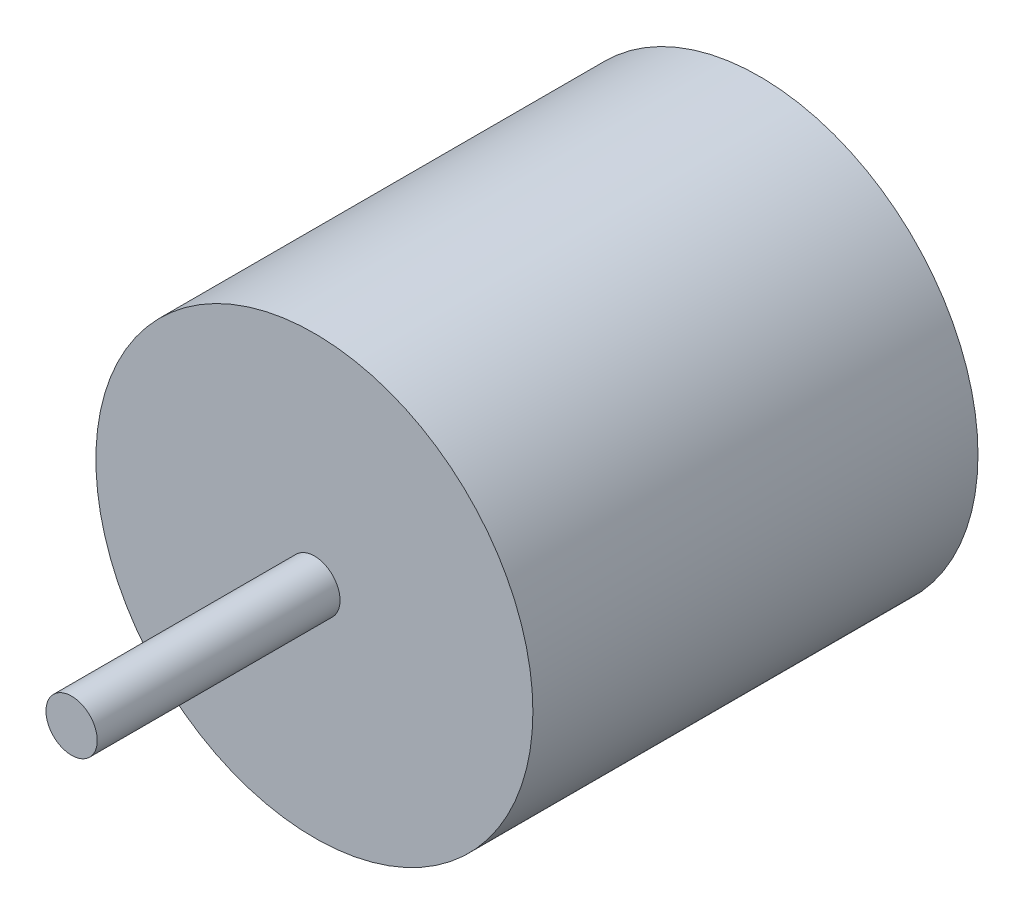
ISO-10303-21;
HEADER;
FILE_DESCRIPTION(('STEP AP214'),'2;1');
FILE_NAME('part.step','',(''),(''),'','','');
FILE_SCHEMA(('AUTOMOTIVE_DESIGN { 1 0 10303 214 1 1 1 1 }'));
ENDSEC;
DATA;
#1=APPLICATION_CONTEXT('core data for automotive mechanical design processes');
#2=APPLICATION_PROTOCOL_DEFINITION('international standard','automotive_design',2000,#1);
#3=PRODUCT_CONTEXT('',#1,'mechanical');
#4=PRODUCT('Part','Part','',(#3));
#5=PRODUCT_RELATED_PRODUCT_CATEGORY('part','',(#4));
#6=PRODUCT_DEFINITION_FORMATION('','',#4);
#7=PRODUCT_DEFINITION_CONTEXT('part definition',#1,'design');
#8=PRODUCT_DEFINITION('design','',#6,#7);
#9=PRODUCT_DEFINITION_SHAPE('','',#8);
#10=(LENGTH_UNIT() NAMED_UNIT(*) SI_UNIT(.MILLI.,.METRE.));
#11=(NAMED_UNIT(*) PLANE_ANGLE_UNIT() SI_UNIT($,.RADIAN.));
#12=(NAMED_UNIT(*) SI_UNIT($,.STERADIAN.) SOLID_ANGLE_UNIT());
#13=UNCERTAINTY_MEASURE_WITH_UNIT(LENGTH_MEASURE(1.E-05),#10,'distance_accuracy_value','');
#14=(GEOMETRIC_REPRESENTATION_CONTEXT(3) GLOBAL_UNCERTAINTY_ASSIGNED_CONTEXT((#13)) GLOBAL_UNIT_ASSIGNED_CONTEXT((#10,
#11,#12)) REPRESENTATION_CONTEXT('',''));
#15=CARTESIAN_POINT('',(0.,0.,0.));
#16=DIRECTION('',(0.,0.,1.));
#17=DIRECTION('',(1.,0.,0.));
#18=AXIS2_PLACEMENT_3D('',#15,#16,#17);
#19=CARTESIAN_POINT('',(0.,0.,27.5));
#20=DIRECTION('',(0.,0.,-1.));
#21=DIRECTION('',(-1.,0.,0.));
#22=AXIS2_PLACEMENT_3D('',#19,#20,#21);
#23=CYLINDRICAL_SURFACE('',#22,13.5);
#24=CARTESIAN_POINT('',(0.,0.,27.5));
#25=DIRECTION('',(0.,0.,1.));
#26=DIRECTION('',(1.,0.,0.));
#27=AXIS2_PLACEMENT_3D('',#24,#25,#26);
#28=CIRCLE('',#27,13.5);
#29=CARTESIAN_POINT('',(13.5,0.,27.5));
#30=VERTEX_POINT('',#29);
#31=EDGE_CURVE('E10',#30,#30,#28,.T.);
#32=ORIENTED_EDGE('',*,*,#31,.F.);
#33=EDGE_LOOP('',(#32));
#34=FACE_BOUND('',#33,.T.);
#35=CARTESIAN_POINT('',(0.,0.,0.));
#36=DIRECTION('',(0.,0.,1.));
#37=DIRECTION('',(1.,0.,0.));
#38=AXIS2_PLACEMENT_3D('',#35,#36,#37);
#39=CIRCLE('',#38,13.5);
#40=CARTESIAN_POINT('',(13.5,0.,0.));
#41=VERTEX_POINT('',#40);
#42=EDGE_CURVE('E46',#41,#41,#39,.T.);
#43=ORIENTED_EDGE('',*,*,#42,.T.);
#44=EDGE_LOOP('',(#43));
#45=FACE_BOUND('',#44,.T.);
#46=ADVANCED_FACE('F43',(#34,#45),#23,.T.);
#47=CARTESIAN_POINT('',(0.,0.,27.5));
#48=DIRECTION('',(0.,0.,1.));
#49=DIRECTION('',(1.,0.,0.));
#50=AXIS2_PLACEMENT_3D('',#47,#48,#49);
#51=PLANE('',#50);
#52=CARTESIAN_POINT('',(0.,0.,27.5));
#53=DIRECTION('',(0.,0.,1.));
#54=DIRECTION('',(1.,0.,0.));
#55=AXIS2_PLACEMENT_3D('',#52,#53,#54);
#56=CIRCLE('',#55,1.585);
#57=CARTESIAN_POINT('',(1.585,0.,27.5));
#58=VERTEX_POINT('',#57);
#59=EDGE_CURVE('E57',#58,#58,#56,.T.);
#60=ORIENTED_EDGE('',*,*,#59,.F.);
#61=EDGE_LOOP('',(#60));
#62=FACE_BOUND('',#61,.T.);
#63=ORIENTED_EDGE('',*,*,#31,.T.);
#64=EDGE_LOOP('',(#63));
#65=FACE_BOUND('',#64,.T.);
#66=ADVANCED_FACE('F74',(#62,#65),#51,.T.);
#67=CARTESIAN_POINT('',(0.,0.,0.));
#68=DIRECTION('',(0.,0.,1.));
#69=DIRECTION('',(1.,0.,0.));
#70=AXIS2_PLACEMENT_3D('',#67,#68,#69);
#71=PLANE('',#70);
#72=ORIENTED_EDGE('',*,*,#42,.F.);
#73=EDGE_LOOP('',(#72));
#74=FACE_BOUND('',#73,.T.);
#75=ADVANCED_FACE('F70',(#74),#71,.F.);
#76=CARTESIAN_POINT('',(0.,0.,42.5));
#77=DIRECTION('',(0.,0.,-1.));
#78=DIRECTION('',(-1.,0.,0.));
#79=AXIS2_PLACEMENT_3D('',#76,#77,#78);
#80=CYLINDRICAL_SURFACE('',#79,1.585);
#81=CARTESIAN_POINT('',(0.,0.,42.5));
#82=DIRECTION('',(0.,0.,1.));
#83=DIRECTION('',(1.,0.,0.));
#84=AXIS2_PLACEMENT_3D('',#81,#82,#83);
#85=CIRCLE('',#84,1.585);
#86=CARTESIAN_POINT('',(1.585,0.,42.5));
#87=VERTEX_POINT('',#86);
#88=EDGE_CURVE('E55',#87,#87,#85,.T.);
#89=ORIENTED_EDGE('',*,*,#88,.F.);
#90=EDGE_LOOP('',(#89));
#91=FACE_BOUND('',#90,.T.);
#92=ORIENTED_EDGE('',*,*,#59,.T.);
#93=EDGE_LOOP('',(#92));
#94=FACE_BOUND('',#93,.T.);
#95=ADVANCED_FACE('F67',(#91,#94),#80,.T.);
#96=CARTESIAN_POINT('',(0.,0.,42.5));
#97=DIRECTION('',(0.,0.,1.));
#98=DIRECTION('',(1.,0.,0.));
#99=AXIS2_PLACEMENT_3D('',#96,#97,#98);
#100=PLANE('',#99);
#101=ORIENTED_EDGE('',*,*,#88,.T.);
#102=EDGE_LOOP('',(#101));
#103=FACE_BOUND('',#102,.T.);
#104=ADVANCED_FACE('F65',(#103),#100,.T.);
#105=CLOSED_SHELL('',(#46,#66,#75,#95,#104));
#106=MANIFOLD_SOLID_BREP('B2',#105);
#107=ADVANCED_BREP_SHAPE_REPRESENTATION('',(#18,#106),#14);
#108=SHAPE_DEFINITION_REPRESENTATION(#9,#107);
ENDSEC;
END-ISO-10303-21;
